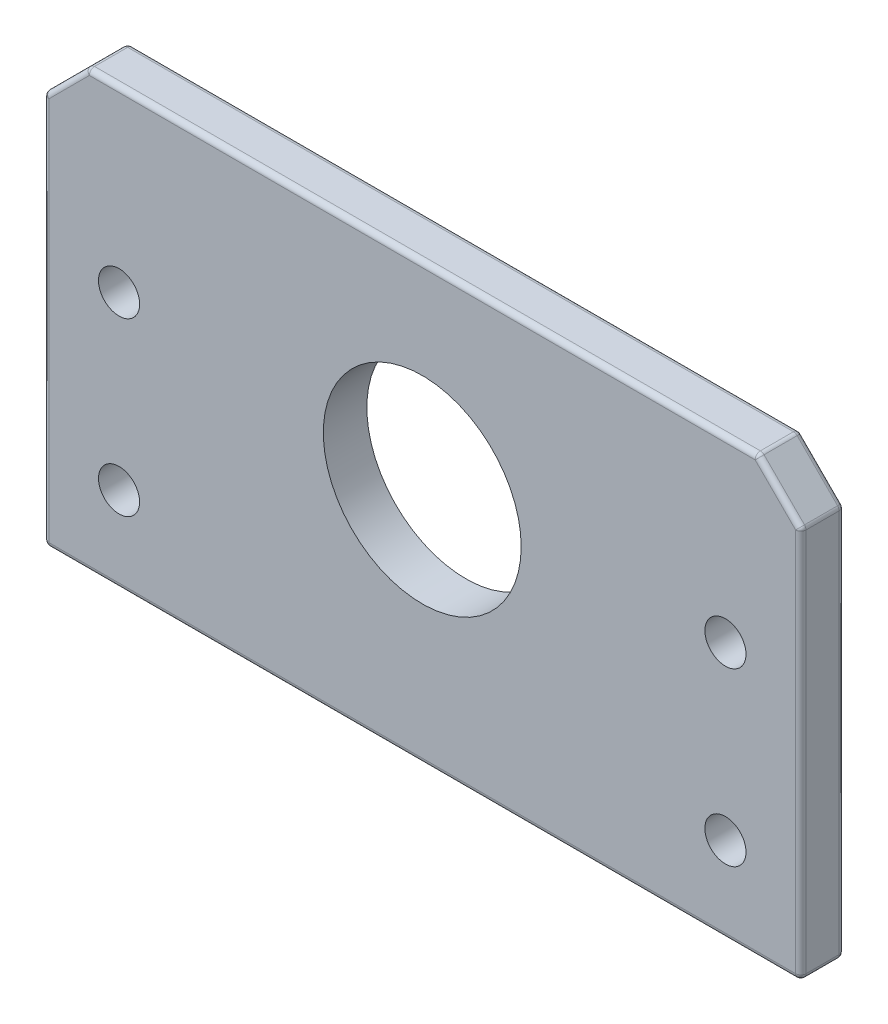
ISO-10303-21;
HEADER;
FILE_DESCRIPTION(('STEP AP214'),'2;1');
FILE_NAME('part.step','',(''),(''),'','','');
FILE_SCHEMA(('AUTOMOTIVE_DESIGN { 1 0 10303 214 1 1 1 1 }'));
ENDSEC;
DATA;
#1=APPLICATION_CONTEXT('core data for automotive mechanical design processes');
#2=APPLICATION_PROTOCOL_DEFINITION('international standard','automotive_design',2000,#1);
#3=PRODUCT_CONTEXT('',#1,'mechanical');
#4=PRODUCT('Part','Part','',(#3));
#5=PRODUCT_RELATED_PRODUCT_CATEGORY('part','',(#4));
#6=PRODUCT_DEFINITION_FORMATION('','',#4);
#7=PRODUCT_DEFINITION_CONTEXT('part definition',#1,'design');
#8=PRODUCT_DEFINITION('design','',#6,#7);
#9=PRODUCT_DEFINITION_SHAPE('','',#8);
#10=(LENGTH_UNIT() NAMED_UNIT(*) SI_UNIT(.MILLI.,.METRE.));
#11=(NAMED_UNIT(*) PLANE_ANGLE_UNIT() SI_UNIT($,.RADIAN.));
#12=(NAMED_UNIT(*) SI_UNIT($,.STERADIAN.) SOLID_ANGLE_UNIT());
#13=UNCERTAINTY_MEASURE_WITH_UNIT(LENGTH_MEASURE(1.E-05),#10,'distance_accuracy_value','');
#14=(GEOMETRIC_REPRESENTATION_CONTEXT(3) GLOBAL_UNCERTAINTY_ASSIGNED_CONTEXT((#13)) GLOBAL_UNIT_ASSIGNED_CONTEXT((#10,
#11,#12)) REPRESENTATION_CONTEXT('',''));
#15=CARTESIAN_POINT('',(0.,0.,0.));
#16=DIRECTION('',(0.,0.,1.));
#17=DIRECTION('',(1.,0.,0.));
#18=AXIS2_PLACEMENT_3D('',#15,#16,#17);
#19=CARTESIAN_POINT('',(-55.245,-63.5,-3.175));
#20=DIRECTION('',(-1.,0.,0.));
#21=DIRECTION('',(0.,0.,1.));
#22=AXIS2_PLACEMENT_3D('',#19,#20,#21);
#23=PLANE('',#22);
#24=DIRECTION('',(0.,1.,0.));
#25=VECTOR('',#24,1.);
#26=CARTESIAN_POINT('',(-55.245,-63.5,-2.413));
#27=LINE('',#26,#25);
#28=CARTESIAN_POINT('',(-55.245,-6.66563073452831,-2.413));
#29=VERTEX_POINT('',#28);
#30=CARTESIAN_POINT('',(-55.245,-62.738,-2.413));
#31=VERTEX_POINT('',#30);
#32=EDGE_CURVE('E48',#29,#31,#27,.F.);
#33=ORIENTED_EDGE('',*,*,#32,.T.);
#34=DIRECTION('',(0.,0.,1.));
#35=VECTOR('',#34,1.);
#36=CARTESIAN_POINT('',(-55.245,-62.738,3.175));
#37=LINE('',#36,#35);
#38=CARTESIAN_POINT('',(-55.245,-62.738,2.413));
#39=VERTEX_POINT('',#38);
#40=EDGE_CURVE('E11',#31,#39,#37,.T.);
#41=ORIENTED_EDGE('',*,*,#40,.T.);
#42=DIRECTION('',(0.,1.,0.));
#43=VECTOR('',#42,1.);
#44=CARTESIAN_POINT('',(-55.245,-63.5,2.413));
#45=LINE('',#44,#43);
#46=CARTESIAN_POINT('',(-55.245,-6.66563073452831,2.413));
#47=VERTEX_POINT('',#46);
#48=EDGE_CURVE('E271',#39,#47,#45,.T.);
#49=ORIENTED_EDGE('',*,*,#48,.T.);
#50=DIRECTION('',(0.,0.,1.));
#51=VECTOR('',#50,1.);
#52=CARTESIAN_POINT('',(-55.245,-6.66563073452831,-3.175));
#53=LINE('',#52,#51);
#54=EDGE_CURVE('E59',#47,#29,#53,.F.);
#55=ORIENTED_EDGE('',*,*,#54,.T.);
#56=EDGE_LOOP('',(#33,#41,#49,#55));
#57=FACE_BOUND('',#56,.T.);
#58=ADVANCED_FACE('F39',(#57),#23,.T.);
#59=CARTESIAN_POINT('',(-55.245,-63.5,-3.175));
#60=DIRECTION('',(0.,0.,-1.));
#61=DIRECTION('',(-1.,0.,0.));
#62=AXIS2_PLACEMENT_3D('',#59,#60,#61);
#63=PLANE('',#62);
#64=DIRECTION('',(0.,1.,0.));
#65=VECTOR('',#64,1.);
#66=CARTESIAN_POINT('',(54.483,-63.5,-3.175));
#67=LINE('',#66,#65);
#68=CARTESIAN_POINT('',(54.483,-6.66563073452829,-3.175));
#69=VERTEX_POINT('',#68);
#70=CARTESIAN_POINT('',(54.483,-62.738,-3.175));
#71=VERTEX_POINT('',#70);
#72=EDGE_CURVE('E231',#69,#71,#67,.F.);
#73=ORIENTED_EDGE('',*,*,#72,.T.);
#74=DIRECTION('',(-1.,0.,0.));
#75=VECTOR('',#74,1.);
#76=CARTESIAN_POINT('',(-55.245,-62.738,-3.175));
#77=LINE('',#76,#75);
#78=CARTESIAN_POINT('',(-54.483,-62.738,-3.175));
#79=VERTEX_POINT('',#78);
#80=EDGE_CURVE('E233',#71,#79,#77,.T.);
#81=ORIENTED_EDGE('',*,*,#80,.T.);
#82=DIRECTION('',(0.,1.,0.));
#83=VECTOR('',#82,1.);
#84=CARTESIAN_POINT('',(-54.483,-63.5,-3.175));
#85=LINE('',#84,#83);
#86=CARTESIAN_POINT('',(-54.483,-6.66563073452831,-3.175));
#87=VERTEX_POINT('',#86);
#88=EDGE_CURVE('E223',#79,#87,#85,.T.);
#89=ORIENTED_EDGE('',*,*,#88,.T.);
#90=DIRECTION('',(-0.707106781186546,-0.707106781186549,0.));
#91=VECTOR('',#90,1.);
#92=CARTESIAN_POINT('',(-83.2811846327358,-35.4638153672643,-3.175));
#93=LINE('',#92,#91);
#94=CARTESIAN_POINT('',(-48.5793692654717,-0.762,-3.175));
#95=VERTEX_POINT('',#94);
#96=EDGE_CURVE('E225',#87,#95,#93,.F.);
#97=ORIENTED_EDGE('',*,*,#96,.T.);
#98=DIRECTION('',(-1.,0.,0.));
#99=VECTOR('',#98,1.);
#100=CARTESIAN_POINT('',(-55.245,-0.761999999999999,-3.175));
#101=LINE('',#100,#99);
#102=CARTESIAN_POINT('',(48.5793692654717,-0.762,-3.175));
#103=VERTEX_POINT('',#102);
#104=EDGE_CURVE('E227',#95,#103,#101,.F.);
#105=ORIENTED_EDGE('',*,*,#104,.T.);
#106=DIRECTION('',(-0.707106781186546,0.707106781186549,0.));
#107=VECTOR('',#106,1.);
#108=CARTESIAN_POINT('',(28.0361846327361,19.7811846327357,-3.175));
#109=LINE('',#108,#107);
#110=EDGE_CURVE('E229',#103,#69,#109,.F.);
#111=ORIENTED_EDGE('',*,*,#110,.T.);
#112=EDGE_LOOP('',(#73,#81,#89,#97,#105,#111));
#113=FACE_BOUND('',#112,.T.);
#114=CARTESIAN_POINT('',(-44.245,-26.,-3.175));
#115=DIRECTION('',(0.,0.,-1.));
#116=DIRECTION('',(-1.,0.,0.));
#117=AXIS2_PLACEMENT_3D('',#114,#115,#116);
#118=CIRCLE('',#117,3.);
#119=CARTESIAN_POINT('',(-47.245,-26.,-3.175));
#120=VERTEX_POINT('',#119);
#121=EDGE_CURVE('E364',#120,#120,#118,.T.);
#122=ORIENTED_EDGE('',*,*,#121,.F.);
#123=EDGE_LOOP('',(#122));
#124=FACE_BOUND('',#123,.T.);
#125=CARTESIAN_POINT('',(-44.245,-51.,-3.175));
#126=DIRECTION('',(0.,0.,-1.));
#127=DIRECTION('',(-1.,0.,0.));
#128=AXIS2_PLACEMENT_3D('',#125,#126,#127);
#129=CIRCLE('',#128,3.);
#130=CARTESIAN_POINT('',(-47.245,-51.,-3.175));
#131=VERTEX_POINT('',#130);
#132=EDGE_CURVE('E375',#131,#131,#129,.T.);
#133=ORIENTED_EDGE('',*,*,#132,.F.);
#134=EDGE_LOOP('',(#133));
#135=FACE_BOUND('',#134,.T.);
#136=CARTESIAN_POINT('',(44.245,-51.,-3.175));
#137=DIRECTION('',(0.,0.,-1.));
#138=DIRECTION('',(-1.,0.,0.));
#139=AXIS2_PLACEMENT_3D('',#136,#137,#138);
#140=CIRCLE('',#139,3.);
#141=CARTESIAN_POINT('',(41.245,-51.,-3.175));
#142=VERTEX_POINT('',#141);
#143=EDGE_CURVE('E383',#142,#142,#140,.T.);
#144=ORIENTED_EDGE('',*,*,#143,.F.);
#145=EDGE_LOOP('',(#144));
#146=FACE_BOUND('',#145,.T.);
#147=CARTESIAN_POINT('',(44.245,-26.,-3.175));
#148=DIRECTION('',(0.,0.,-1.));
#149=DIRECTION('',(-1.,0.,0.));
#150=AXIS2_PLACEMENT_3D('',#147,#148,#149);
#151=CIRCLE('',#150,3.);
#152=CARTESIAN_POINT('',(41.245,-26.,-3.175));
#153=VERTEX_POINT('',#152);
#154=EDGE_CURVE('E389',#153,#153,#151,.T.);
#155=ORIENTED_EDGE('',*,*,#154,.F.);
#156=EDGE_LOOP('',(#155));
#157=FACE_BOUND('',#156,.T.);
#158=CARTESIAN_POINT('',(0.,-28.8150046,-3.175));
#159=DIRECTION('',(0.,0.,1.));
#160=DIRECTION('',(1.,0.,0.));
#161=AXIS2_PLACEMENT_3D('',#158,#159,#160);
#162=CIRCLE('',#161,14.437499981);
#163=CARTESIAN_POINT('',(14.437499981,-28.8150046,-3.175));
#164=VERTEX_POINT('',#163);
#165=EDGE_CURVE('E200',#164,#164,#162,.T.);
#166=ORIENTED_EDGE('',*,*,#165,.T.);
#167=EDGE_LOOP('',(#166));
#168=FACE_BOUND('',#167,.T.);
#169=ADVANCED_FACE('F412',(#113,#124,#135,#146,#157,#168),#63,.T.);
#170=CARTESIAN_POINT('',(55.245,-63.5,-3.175));
#171=DIRECTION('',(1.,0.,0.));
#172=DIRECTION('',(0.,0.,-1.));
#173=AXIS2_PLACEMENT_3D('',#170,#171,#172);
#174=PLANE('',#173);
#175=DIRECTION('',(0.,1.,0.));
#176=VECTOR('',#175,1.);
#177=CARTESIAN_POINT('',(55.245,-63.5,2.413));
#178=LINE('',#177,#176);
#179=CARTESIAN_POINT('',(55.245,-6.66563073452831,2.413));
#180=VERTEX_POINT('',#179);
#181=CARTESIAN_POINT('',(55.245,-62.738,2.413));
#182=VERTEX_POINT('',#181);
#183=EDGE_CURVE('E240',#180,#182,#178,.F.);
#184=ORIENTED_EDGE('',*,*,#183,.T.);
#185=DIRECTION('',(0.,0.,-1.));
#186=VECTOR('',#185,1.);
#187=CARTESIAN_POINT('',(55.245,-62.738,-3.175));
#188=LINE('',#187,#186);
#189=CARTESIAN_POINT('',(55.245,-62.738,-2.413));
#190=VERTEX_POINT('',#189);
#191=EDGE_CURVE('E242',#182,#190,#188,.T.);
#192=ORIENTED_EDGE('',*,*,#191,.T.);
#193=DIRECTION('',(0.,1.,0.));
#194=VECTOR('',#193,1.);
#195=CARTESIAN_POINT('',(55.245,-63.5,-2.413));
#196=LINE('',#195,#194);
#197=CARTESIAN_POINT('',(55.245,-6.66563073452831,-2.413));
#198=VERTEX_POINT('',#197);
#199=EDGE_CURVE('E238',#190,#198,#196,.T.);
#200=ORIENTED_EDGE('',*,*,#199,.T.);
#201=DIRECTION('',(0.,0.,-1.));
#202=VECTOR('',#201,1.);
#203=CARTESIAN_POINT('',(55.245,-6.66563073452831,-3.175));
#204=LINE('',#203,#202);
#205=EDGE_CURVE('E236',#198,#180,#204,.F.);
#206=ORIENTED_EDGE('',*,*,#205,.T.);
#207=EDGE_LOOP('',(#184,#192,#200,#206));
#208=FACE_BOUND('',#207,.T.);
#209=ADVANCED_FACE('F403',(#208),#174,.T.);
#210=CARTESIAN_POINT('',(-55.245,-63.5,3.175));
#211=DIRECTION('',(0.,0.,1.));
#212=DIRECTION('',(1.,0.,0.));
#213=AXIS2_PLACEMENT_3D('',#210,#211,#212);
#214=PLANE('',#213);
#215=DIRECTION('',(0.,1.,0.));
#216=VECTOR('',#215,1.);
#217=CARTESIAN_POINT('',(-54.483,-63.5,3.175));
#218=LINE('',#217,#216);
#219=CARTESIAN_POINT('',(-54.483,-6.66563073452831,3.175));
#220=VERTEX_POINT('',#219);
#221=CARTESIAN_POINT('',(-54.483,-62.738,3.175));
#222=VERTEX_POINT('',#221);
#223=EDGE_CURVE('E169',#220,#222,#218,.F.);
#224=ORIENTED_EDGE('',*,*,#223,.T.);
#225=DIRECTION('',(1.,0.,0.));
#226=VECTOR('',#225,1.);
#227=CARTESIAN_POINT('',(55.245,-62.738,3.175));
#228=LINE('',#227,#226);
#229=CARTESIAN_POINT('',(54.483,-62.738,3.175));
#230=VERTEX_POINT('',#229);
#231=EDGE_CURVE('E212',#222,#230,#228,.T.);
#232=ORIENTED_EDGE('',*,*,#231,.T.);
#233=DIRECTION('',(0.,1.,0.));
#234=VECTOR('',#233,1.);
#235=CARTESIAN_POINT('',(54.483,-63.5,3.175));
#236=LINE('',#235,#234);
#237=CARTESIAN_POINT('',(54.483,-6.66563073452829,3.175));
#238=VERTEX_POINT('',#237);
#239=EDGE_CURVE('E210',#230,#238,#236,.T.);
#240=ORIENTED_EDGE('',*,*,#239,.T.);
#241=DIRECTION('',(0.707106781186546,-0.707106781186549,0.));
#242=VECTOR('',#241,1.);
#243=CARTESIAN_POINT('',(28.0361846327361,19.7811846327357,3.175));
#244=LINE('',#243,#242);
#245=CARTESIAN_POINT('',(48.5793692654717,-0.762,3.175));
#246=VERTEX_POINT('',#245);
#247=EDGE_CURVE('E208',#238,#246,#244,.F.);
#248=ORIENTED_EDGE('',*,*,#247,.T.);
#249=DIRECTION('',(1.,0.,0.));
#250=VECTOR('',#249,1.);
#251=CARTESIAN_POINT('',(-55.245,-0.761999999999999,3.175));
#252=LINE('',#251,#250);
#253=CARTESIAN_POINT('',(-48.5793692654717,-0.762000000000001,3.175));
#254=VERTEX_POINT('',#253);
#255=EDGE_CURVE('E172',#246,#254,#252,.F.);
#256=ORIENTED_EDGE('',*,*,#255,.T.);
#257=DIRECTION('',(0.707106781186546,0.707106781186549,0.));
#258=VECTOR('',#257,1.);
#259=CARTESIAN_POINT('',(-83.2811846327358,-35.4638153672643,3.175));
#260=LINE('',#259,#258);
#261=EDGE_CURVE('E163',#254,#220,#260,.F.);
#262=ORIENTED_EDGE('',*,*,#261,.T.);
#263=EDGE_LOOP('',(#224,#232,#240,#248,#256,#262));
#264=FACE_BOUND('',#263,.T.);
#265=CARTESIAN_POINT('',(-44.245,-26.,3.175));
#266=DIRECTION('',(0.,0.,-1.));
#267=DIRECTION('',(-1.,0.,0.));
#268=AXIS2_PLACEMENT_3D('',#265,#266,#267);
#269=CIRCLE('',#268,3.);
#270=CARTESIAN_POINT('',(-47.245,-26.,3.175));
#271=VERTEX_POINT('',#270);
#272=EDGE_CURVE('E370',#271,#271,#269,.T.);
#273=ORIENTED_EDGE('',*,*,#272,.T.);
#274=EDGE_LOOP('',(#273));
#275=FACE_BOUND('',#274,.T.);
#276=CARTESIAN_POINT('',(-44.245,-51.,3.175));
#277=DIRECTION('',(0.,0.,-1.));
#278=DIRECTION('',(-1.,0.,0.));
#279=AXIS2_PLACEMENT_3D('',#276,#277,#278);
#280=CIRCLE('',#279,3.);
#281=CARTESIAN_POINT('',(-47.245,-51.,3.175));
#282=VERTEX_POINT('',#281);
#283=EDGE_CURVE('E380',#282,#282,#280,.T.);
#284=ORIENTED_EDGE('',*,*,#283,.T.);
#285=EDGE_LOOP('',(#284));
#286=FACE_BOUND('',#285,.T.);
#287=CARTESIAN_POINT('',(44.245,-51.,3.175));
#288=DIRECTION('',(0.,0.,-1.));
#289=DIRECTION('',(-1.,0.,0.));
#290=AXIS2_PLACEMENT_3D('',#287,#288,#289);
#291=CIRCLE('',#290,3.);
#292=CARTESIAN_POINT('',(41.245,-51.,3.175));
#293=VERTEX_POINT('',#292);
#294=EDGE_CURVE('E386',#293,#293,#291,.T.);
#295=ORIENTED_EDGE('',*,*,#294,.T.);
#296=EDGE_LOOP('',(#295));
#297=FACE_BOUND('',#296,.T.);
#298=CARTESIAN_POINT('',(44.245,-26.,3.175));
#299=DIRECTION('',(0.,0.,-1.));
#300=DIRECTION('',(-1.,0.,0.));
#301=AXIS2_PLACEMENT_3D('',#298,#299,#300);
#302=CIRCLE('',#301,3.);
#303=CARTESIAN_POINT('',(41.245,-26.,3.175));
#304=VERTEX_POINT('',#303);
#305=EDGE_CURVE('E392',#304,#304,#302,.T.);
#306=ORIENTED_EDGE('',*,*,#305,.T.);
#307=EDGE_LOOP('',(#306));
#308=FACE_BOUND('',#307,.T.);
#309=CARTESIAN_POINT('',(0.,-28.8150046,3.175));
#310=DIRECTION('',(0.,0.,1.));
#311=DIRECTION('',(1.,0.,0.));
#312=AXIS2_PLACEMENT_3D('',#309,#310,#311);
#313=CIRCLE('',#312,14.437499981);
#314=CARTESIAN_POINT('',(14.437499981,-28.8150046,3.175));
#315=VERTEX_POINT('',#314);
#316=EDGE_CURVE('E203',#315,#315,#313,.T.);
#317=ORIENTED_EDGE('',*,*,#316,.F.);
#318=EDGE_LOOP('',(#317));
#319=FACE_BOUND('',#318,.T.);
#320=ADVANCED_FACE('F165',(#264,#275,#286,#297,#308,#319),#214,.T.);
#321=CARTESIAN_POINT('',(0.,-63.5,0.));
#322=DIRECTION('',(0.,1.,0.));
#323=DIRECTION('',(0.,0.,1.));
#324=AXIS2_PLACEMENT_3D('',#321,#322,#323);
#325=PLANE('',#324);
#326=DIRECTION('',(-1.,0.,0.));
#327=VECTOR('',#326,1.);
#328=CARTESIAN_POINT('',(55.245,-63.5,-2.413));
#329=LINE('',#328,#327);
#330=CARTESIAN_POINT('',(-54.483,-63.5,-2.413));
#331=VERTEX_POINT('',#330);
#332=CARTESIAN_POINT('',(54.483,-63.5,-2.413));
#333=VERTEX_POINT('',#332);
#334=EDGE_CURVE('E216',#331,#333,#329,.F.);
#335=ORIENTED_EDGE('',*,*,#334,.T.);
#336=DIRECTION('',(0.,0.,-1.));
#337=VECTOR('',#336,1.);
#338=CARTESIAN_POINT('',(54.483,-63.5,3.175));
#339=LINE('',#338,#337);
#340=CARTESIAN_POINT('',(54.483,-63.5,2.413));
#341=VERTEX_POINT('',#340);
#342=EDGE_CURVE('E221',#333,#341,#339,.F.);
#343=ORIENTED_EDGE('',*,*,#342,.T.);
#344=DIRECTION('',(1.,0.,0.));
#345=VECTOR('',#344,1.);
#346=CARTESIAN_POINT('',(-55.245,-63.5,2.413));
#347=LINE('',#346,#345);
#348=CARTESIAN_POINT('',(-54.483,-63.5,2.413));
#349=VERTEX_POINT('',#348);
#350=EDGE_CURVE('E218',#341,#349,#347,.F.);
#351=ORIENTED_EDGE('',*,*,#350,.T.);
#352=DIRECTION('',(0.,0.,1.));
#353=VECTOR('',#352,1.);
#354=CARTESIAN_POINT('',(-54.483,-63.5,-3.175));
#355=LINE('',#354,#353);
#356=EDGE_CURVE('E214',#349,#331,#355,.F.);
#357=ORIENTED_EDGE('',*,*,#356,.T.);
#358=EDGE_LOOP('',(#335,#343,#351,#357));
#359=FACE_BOUND('',#358,.T.);
#360=ADVANCED_FACE('F402',(#359),#325,.F.);
#361=CARTESIAN_POINT('',(0.,0.,0.));
#362=DIRECTION('',(0.,1.,0.));
#363=DIRECTION('',(0.,0.,1.));
#364=AXIS2_PLACEMENT_3D('',#361,#362,#363);
#365=PLANE('',#364);
#366=DIRECTION('',(1.,0.,0.));
#367=VECTOR('',#366,1.);
#368=CARTESIAN_POINT('',(0.,0.,2.413));
#369=LINE('',#368,#367);
#370=CARTESIAN_POINT('',(-48.5793692654717,0.,2.413));
#371=VERTEX_POINT('',#370);
#372=CARTESIAN_POINT('',(48.5793692654717,0.,2.413));
#373=VERTEX_POINT('',#372);
#374=EDGE_CURVE('E258',#371,#373,#369,.T.);
#375=ORIENTED_EDGE('',*,*,#374,.T.);
#376=DIRECTION('',(0.,0.,1.));
#377=VECTOR('',#376,1.);
#378=CARTESIAN_POINT('',(48.5793692654717,0.,0.));
#379=LINE('',#378,#377);
#380=CARTESIAN_POINT('',(48.5793692654717,0.,-2.413));
#381=VERTEX_POINT('',#380);
#382=EDGE_CURVE('E260',#373,#381,#379,.F.);
#383=ORIENTED_EDGE('',*,*,#382,.T.);
#384=DIRECTION('',(-1.,0.,0.));
#385=VECTOR('',#384,1.);
#386=CARTESIAN_POINT('',(0.,0.,-2.413));
#387=LINE('',#386,#385);
#388=CARTESIAN_POINT('',(-48.5793692654717,0.,-2.413));
#389=VERTEX_POINT('',#388);
#390=EDGE_CURVE('E256',#381,#389,#387,.T.);
#391=ORIENTED_EDGE('',*,*,#390,.T.);
#392=DIRECTION('',(0.,0.,-1.));
#393=VECTOR('',#392,1.);
#394=CARTESIAN_POINT('',(-48.5793692654717,0.,0.));
#395=LINE('',#394,#393);
#396=EDGE_CURVE('E254',#389,#371,#395,.F.);
#397=ORIENTED_EDGE('',*,*,#396,.T.);
#398=EDGE_LOOP('',(#375,#383,#391,#397));
#399=FACE_BOUND('',#398,.T.);
#400=ADVANCED_FACE('F409',(#399),#365,.T.);
#401=CARTESIAN_POINT('',(0.,-28.8150046,-3.175));
#402=DIRECTION('',(0.,0.,1.));
#403=DIRECTION('',(1.,0.,0.));
#404=AXIS2_PLACEMENT_3D('',#401,#402,#403);
#405=CYLINDRICAL_SURFACE('',#404,14.437499981);
#406=ORIENTED_EDGE('',*,*,#165,.F.);
#407=EDGE_LOOP('',(#406));
#408=FACE_BOUND('',#407,.T.);
#409=ORIENTED_EDGE('',*,*,#316,.T.);
#410=EDGE_LOOP('',(#409));
#411=FACE_BOUND('',#410,.T.);
#412=ADVANCED_FACE('F399',(#408,#411),#405,.F.);
#413=CARTESIAN_POINT('',(-48.895,0.,0.));
#414=DIRECTION('',(0.707106781186549,-0.707106781186546,0.));
#415=DIRECTION('',(0.,0.,1.));
#416=AXIS2_PLACEMENT_3D('',#413,#414,#415);
#417=PLANE('',#416);
#418=DIRECTION('',(-0.707106781186546,-0.707106781186549,0.));
#419=VECTOR('',#418,1.);
#420=CARTESIAN_POINT('',(-48.895,0.,2.413));
#421=LINE('',#420,#419);
#422=CARTESIAN_POINT('',(-55.0218153672642,-6.12681536726416,2.413));
#423=VERTEX_POINT('',#422);
#424=CARTESIAN_POINT('',(-49.1181846327359,-0.223184632735852,2.413));
#425=VERTEX_POINT('',#424);
#426=EDGE_CURVE('E182',#423,#425,#421,.F.);
#427=ORIENTED_EDGE('',*,*,#426,.T.);
#428=DIRECTION('',(0.,0.,1.));
#429=VECTOR('',#428,1.);
#430=CARTESIAN_POINT('',(-49.1181846327359,-0.223184632735851,0.));
#431=LINE('',#430,#429);
#432=CARTESIAN_POINT('',(-49.1181846327359,-0.223184632735852,-2.413));
#433=VERTEX_POINT('',#432);
#434=EDGE_CURVE('E268',#425,#433,#431,.F.);
#435=ORIENTED_EDGE('',*,*,#434,.T.);
#436=DIRECTION('',(0.707106781186546,0.707106781186549,0.));
#437=VECTOR('',#436,1.);
#438=CARTESIAN_POINT('',(-48.895,0.,-2.413));
#439=LINE('',#438,#437);
#440=CARTESIAN_POINT('',(-55.0218153672642,-6.12681536726416,-2.413));
#441=VERTEX_POINT('',#440);
#442=EDGE_CURVE('E265',#433,#441,#439,.F.);
#443=ORIENTED_EDGE('',*,*,#442,.T.);
#444=DIRECTION('',(0.,0.,-1.));
#445=VECTOR('',#444,1.);
#446=CARTESIAN_POINT('',(-55.0218153672642,-6.12681536726416,0.));
#447=LINE('',#446,#445);
#448=EDGE_CURVE('E263',#441,#423,#447,.F.);
#449=ORIENTED_EDGE('',*,*,#448,.T.);
#450=EDGE_LOOP('',(#427,#435,#443,#449));
#451=FACE_BOUND('',#450,.T.);
#452=ADVANCED_FACE('F424',(#451),#417,.F.);
#453=CARTESIAN_POINT('',(48.895,0.,0.));
#454=DIRECTION('',(-0.707106781186549,-0.707106781186546,0.));
#455=DIRECTION('',(0.,0.,-1.));
#456=AXIS2_PLACEMENT_3D('',#453,#454,#455);
#457=PLANE('',#456);
#458=DIRECTION('',(0.,0.,1.));
#459=VECTOR('',#458,1.);
#460=CARTESIAN_POINT('',(55.0218153672642,-6.12681536726416,0.));
#461=LINE('',#460,#459);
#462=CARTESIAN_POINT('',(55.0218153672642,-6.12681536726416,2.413));
#463=VERTEX_POINT('',#462);
#464=CARTESIAN_POINT('',(55.0218153672642,-6.12681536726416,-2.413));
#465=VERTEX_POINT('',#464);
#466=EDGE_CURVE('E249',#463,#465,#461,.F.);
#467=ORIENTED_EDGE('',*,*,#466,.T.);
#468=DIRECTION('',(0.707106781186546,-0.707106781186549,0.));
#469=VECTOR('',#468,1.);
#470=CARTESIAN_POINT('',(48.895,0.,-2.413));
#471=LINE('',#470,#469);
#472=CARTESIAN_POINT('',(49.1181846327359,-0.223184632735851,-2.413));
#473=VERTEX_POINT('',#472);
#474=EDGE_CURVE('E251',#465,#473,#471,.F.);
#475=ORIENTED_EDGE('',*,*,#474,.T.);
#476=DIRECTION('',(0.,0.,-1.));
#477=VECTOR('',#476,1.);
#478=CARTESIAN_POINT('',(49.1181846327359,-0.223184632735851,0.));
#479=LINE('',#478,#477);
#480=CARTESIAN_POINT('',(49.1181846327359,-0.223184632735851,2.413));
#481=VERTEX_POINT('',#480);
#482=EDGE_CURVE('E245',#473,#481,#479,.F.);
#483=ORIENTED_EDGE('',*,*,#482,.T.);
#484=DIRECTION('',(-0.707106781186546,0.707106781186549,0.));
#485=VECTOR('',#484,1.);
#486=CARTESIAN_POINT('',(48.895,0.,2.413));
#487=LINE('',#486,#485);
#488=EDGE_CURVE('E247',#481,#463,#487,.F.);
#489=ORIENTED_EDGE('',*,*,#488,.T.);
#490=EDGE_LOOP('',(#467,#475,#483,#489));
#491=FACE_BOUND('',#490,.T.);
#492=ADVANCED_FACE('F430',(#491),#457,.F.);
#493=CARTESIAN_POINT('',(44.245,-26.,-3.175));
#494=DIRECTION('',(0.,0.,-1.));
#495=DIRECTION('',(-1.,0.,0.));
#496=AXIS2_PLACEMENT_3D('',#493,#494,#495);
#497=CYLINDRICAL_SURFACE('',#496,3.);
#498=ORIENTED_EDGE('',*,*,#305,.F.);
#499=EDGE_LOOP('',(#498));
#500=FACE_BOUND('',#499,.T.);
#501=ORIENTED_EDGE('',*,*,#154,.T.);
#502=EDGE_LOOP('',(#501));
#503=FACE_BOUND('',#502,.T.);
#504=ADVANCED_FACE('F436',(#500,#503),#497,.F.);
#505=CARTESIAN_POINT('',(44.245,-51.,-3.175));
#506=DIRECTION('',(0.,0.,-1.));
#507=DIRECTION('',(-1.,0.,0.));
#508=AXIS2_PLACEMENT_3D('',#505,#506,#507);
#509=CYLINDRICAL_SURFACE('',#508,3.);
#510=ORIENTED_EDGE('',*,*,#294,.F.);
#511=EDGE_LOOP('',(#510));
#512=FACE_BOUND('',#511,.T.);
#513=ORIENTED_EDGE('',*,*,#143,.T.);
#514=EDGE_LOOP('',(#513));
#515=FACE_BOUND('',#514,.T.);
#516=ADVANCED_FACE('F618',(#512,#515),#509,.F.);
#517=CARTESIAN_POINT('',(-44.245,-51.,-3.175));
#518=DIRECTION('',(0.,0.,-1.));
#519=DIRECTION('',(-1.,0.,0.));
#520=AXIS2_PLACEMENT_3D('',#517,#518,#519);
#521=CYLINDRICAL_SURFACE('',#520,3.);
#522=ORIENTED_EDGE('',*,*,#283,.F.);
#523=EDGE_LOOP('',(#522));
#524=FACE_BOUND('',#523,.T.);
#525=ORIENTED_EDGE('',*,*,#132,.T.);
#526=EDGE_LOOP('',(#525));
#527=FACE_BOUND('',#526,.T.);
#528=ADVANCED_FACE('F622',(#524,#527),#521,.F.);
#529=CARTESIAN_POINT('',(-44.245,-26.,-3.175));
#530=DIRECTION('',(0.,0.,-1.));
#531=DIRECTION('',(-1.,0.,0.));
#532=AXIS2_PLACEMENT_3D('',#529,#530,#531);
#533=CYLINDRICAL_SURFACE('',#532,3.);
#534=ORIENTED_EDGE('',*,*,#272,.F.);
#535=EDGE_LOOP('',(#534));
#536=FACE_BOUND('',#535,.T.);
#537=ORIENTED_EDGE('',*,*,#121,.T.);
#538=EDGE_LOOP('',(#537));
#539=FACE_BOUND('',#538,.T.);
#540=ADVANCED_FACE('F547',(#536,#539),#533,.F.);
#541=CARTESIAN_POINT('',(0.,-0.762,-2.413));
#542=DIRECTION('',(-1.,0.,0.));
#543=DIRECTION('',(0.,0.,1.));
#544=AXIS2_PLACEMENT_3D('',#541,#542,#543);
#545=CYLINDRICAL_SURFACE('',#544,0.762);
#546=CARTESIAN_POINT('',(-48.5793692654717,-0.762,-2.413));
#547=DIRECTION('',(-1.,0.,0.));
#548=DIRECTION('',(0.,0.,1.));
#549=AXIS2_PLACEMENT_3D('',#546,#547,#548);
#550=CIRCLE('',#549,0.762);
#551=EDGE_CURVE('E43',#389,#95,#550,.T.);
#552=ORIENTED_EDGE('',*,*,#551,.F.);
#553=ORIENTED_EDGE('',*,*,#390,.F.);
#554=CARTESIAN_POINT('',(48.5793692654717,-0.762,-2.413));
#555=DIRECTION('',(1.,0.,0.));
#556=DIRECTION('',(0.,1.,0.));
#557=AXIS2_PLACEMENT_3D('',#554,#555,#556);
#558=CIRCLE('',#557,0.762);
#559=EDGE_CURVE('E356',#103,#381,#558,.T.);
#560=ORIENTED_EDGE('',*,*,#559,.F.);
#561=ORIENTED_EDGE('',*,*,#104,.F.);
#562=EDGE_LOOP('',(#552,#553,#560,#561));
#563=FACE_BOUND('',#562,.T.);
#564=ADVANCED_FACE('F41',(#563),#545,.T.);
#565=CARTESIAN_POINT('',(-48.5793692654717,-0.762,-2.413));
#566=DIRECTION('',(0.,0.,-1.));
#567=DIRECTION('',(-1.,0.,0.));
#568=AXIS2_PLACEMENT_3D('',#565,#566,#567);
#569=SPHERICAL_SURFACE('',#568,0.762);
#570=CARTESIAN_POINT('',(-48.5793692654717,-0.761999999999999,-2.413));
#571=DIRECTION('',(0.,0.,-1.));
#572=DIRECTION('',(-1.,0.,0.));
#573=AXIS2_PLACEMENT_3D('',#570,#571,#572);
#574=CIRCLE('',#573,0.762);
#575=EDGE_CURVE('E351',#389,#433,#574,.F.);
#576=ORIENTED_EDGE('',*,*,#575,.F.);
#577=ORIENTED_EDGE('',*,*,#551,.T.);
#578=CARTESIAN_POINT('',(-48.5793692654717,-0.762,-2.413));
#579=DIRECTION('',(0.707106781186543,0.707106781186552,0.));
#580=DIRECTION('',(-0.707106781186552,0.707106781186543,0.));
#581=AXIS2_PLACEMENT_3D('',#578,#579,#580);
#582=CIRCLE('',#581,0.762);
#583=EDGE_CURVE('E354',#433,#95,#582,.F.);
#584=ORIENTED_EDGE('',*,*,#583,.F.);
#585=EDGE_LOOP('',(#576,#577,#584));
#586=FACE_BOUND('',#585,.T.);
#587=ADVANCED_FACE('F542',(#586),#569,.T.);
#588=CARTESIAN_POINT('',(48.5793692654717,-0.762,-2.413));
#589=DIRECTION('',(0.,0.,-1.));
#590=DIRECTION('',(-1.,0.,0.));
#591=AXIS2_PLACEMENT_3D('',#588,#589,#590);
#592=SPHERICAL_SURFACE('',#591,0.762);
#593=CARTESIAN_POINT('',(48.5793692654717,-0.762,-2.413));
#594=DIRECTION('',(-0.707106781186548,0.707106781186547,0.));
#595=DIRECTION('',(-0.707106781186547,-0.707106781186548,0.));
#596=AXIS2_PLACEMENT_3D('',#593,#594,#595);
#597=CIRCLE('',#596,0.762);
#598=EDGE_CURVE('E346',#103,#473,#597,.F.);
#599=ORIENTED_EDGE('',*,*,#598,.F.);
#600=ORIENTED_EDGE('',*,*,#559,.T.);
#601=CARTESIAN_POINT('',(48.5793692654717,-0.762,-2.413));
#602=DIRECTION('',(0.,0.,-1.));
#603=DIRECTION('',(-1.,0.,0.));
#604=AXIS2_PLACEMENT_3D('',#601,#602,#603);
#605=CIRCLE('',#604,0.762);
#606=EDGE_CURVE('E349',#473,#381,#605,.F.);
#607=ORIENTED_EDGE('',*,*,#606,.F.);
#608=EDGE_LOOP('',(#599,#600,#607));
#609=FACE_BOUND('',#608,.T.);
#610=ADVANCED_FACE('F539',(#609),#592,.T.);
#611=CARTESIAN_POINT('',(-83.2811846327358,-35.4638153672643,-2.413));
#612=DIRECTION('',(-0.707106781186546,-0.707106781186549,0.));
#613=DIRECTION('',(0.707106781186549,-0.707106781186546,0.));
#614=AXIS2_PLACEMENT_3D('',#611,#612,#613);
#615=CYLINDRICAL_SURFACE('',#614,0.762);
#616=ORIENTED_EDGE('',*,*,#583,.T.);
#617=ORIENTED_EDGE('',*,*,#96,.F.);
#618=CARTESIAN_POINT('',(-54.483,-6.66563073452831,-2.413));
#619=DIRECTION('',(-0.707106781186548,-0.707106781186548,0.));
#620=DIRECTION('',(0.707106781186548,-0.707106781186548,0.));
#621=AXIS2_PLACEMENT_3D('',#618,#619,#620);
#622=CIRCLE('',#621,0.762);
#623=EDGE_CURVE('E343',#441,#87,#622,.T.);
#624=ORIENTED_EDGE('',*,*,#623,.F.);
#625=ORIENTED_EDGE('',*,*,#442,.F.);
#626=EDGE_LOOP('',(#616,#617,#624,#625));
#627=FACE_BOUND('',#626,.T.);
#628=ADVANCED_FACE('F535',(#627),#615,.T.);
#629=CARTESIAN_POINT('',(-48.5793692654717,-0.762,0.));
#630=DIRECTION('',(0.,0.,-1.));
#631=DIRECTION('',(-1.,0.,0.));
#632=AXIS2_PLACEMENT_3D('',#629,#630,#631);
#633=CYLINDRICAL_SURFACE('',#632,0.762);
#634=ORIENTED_EDGE('',*,*,#575,.T.);
#635=ORIENTED_EDGE('',*,*,#434,.F.);
#636=CARTESIAN_POINT('',(-48.5793692654717,-0.762,2.413));
#637=DIRECTION('',(0.,0.,1.));
#638=DIRECTION('',(1.,0.,0.));
#639=AXIS2_PLACEMENT_3D('',#636,#637,#638);
#640=CIRCLE('',#639,0.762);
#641=EDGE_CURVE('E340',#371,#425,#640,.T.);
#642=ORIENTED_EDGE('',*,*,#641,.F.);
#643=ORIENTED_EDGE('',*,*,#396,.F.);
#644=EDGE_LOOP('',(#634,#635,#642,#643));
#645=FACE_BOUND('',#644,.T.);
#646=ADVANCED_FACE('F531',(#645),#633,.T.);
#647=CARTESIAN_POINT('',(0.,-0.762,2.413));
#648=DIRECTION('',(1.,0.,0.));
#649=DIRECTION('',(0.,0.,-1.));
#650=AXIS2_PLACEMENT_3D('',#647,#648,#649);
#651=CYLINDRICAL_SURFACE('',#650,0.762);
#652=CARTESIAN_POINT('',(48.5793692654717,-0.762,2.413));
#653=DIRECTION('',(1.,0.,0.));
#654=DIRECTION('',(0.,0.,-1.));
#655=AXIS2_PLACEMENT_3D('',#652,#653,#654);
#656=CIRCLE('',#655,0.762);
#657=EDGE_CURVE('E334',#373,#246,#656,.T.);
#658=ORIENTED_EDGE('',*,*,#657,.F.);
#659=ORIENTED_EDGE('',*,*,#374,.F.);
#660=CARTESIAN_POINT('',(-48.5793692654717,-0.762,2.413));
#661=DIRECTION('',(-1.,0.,0.));
#662=DIRECTION('',(0.,-1.,0.));
#663=AXIS2_PLACEMENT_3D('',#660,#661,#662);
#664=CIRCLE('',#663,0.762);
#665=EDGE_CURVE('E337',#254,#371,#664,.T.);
#666=ORIENTED_EDGE('',*,*,#665,.F.);
#667=ORIENTED_EDGE('',*,*,#255,.F.);
#668=EDGE_LOOP('',(#658,#659,#666,#667));
#669=FACE_BOUND('',#668,.T.);
#670=ADVANCED_FACE('F527',(#669),#651,.T.);
#671=CARTESIAN_POINT('',(48.5793692654717,-0.762,0.));
#672=DIRECTION('',(0.,0.,1.));
#673=DIRECTION('',(1.,0.,0.));
#674=AXIS2_PLACEMENT_3D('',#671,#672,#673);
#675=CYLINDRICAL_SURFACE('',#674,0.762);
#676=ORIENTED_EDGE('',*,*,#606,.T.);
#677=ORIENTED_EDGE('',*,*,#382,.F.);
#678=CARTESIAN_POINT('',(48.5793692654717,-0.761999999999999,2.413));
#679=DIRECTION('',(0.,0.,1.));
#680=DIRECTION('',(1.,0.,0.));
#681=AXIS2_PLACEMENT_3D('',#678,#679,#680);
#682=CIRCLE('',#681,0.762);
#683=EDGE_CURVE('E331',#481,#373,#682,.T.);
#684=ORIENTED_EDGE('',*,*,#683,.F.);
#685=ORIENTED_EDGE('',*,*,#482,.F.);
#686=EDGE_LOOP('',(#676,#677,#684,#685));
#687=FACE_BOUND('',#686,.T.);
#688=ADVANCED_FACE('F523',(#687),#675,.T.);
#689=CARTESIAN_POINT('',(28.0361846327361,19.7811846327357,-2.413));
#690=DIRECTION('',(-0.707106781186546,0.707106781186549,0.));
#691=DIRECTION('',(-0.707106781186549,-0.707106781186546,0.));
#692=AXIS2_PLACEMENT_3D('',#689,#690,#691);
#693=CYLINDRICAL_SURFACE('',#692,0.762);
#694=ORIENTED_EDGE('',*,*,#598,.T.);
#695=ORIENTED_EDGE('',*,*,#474,.F.);
#696=CARTESIAN_POINT('',(54.483,-6.66563073452829,-2.413));
#697=DIRECTION('',(0.707106781186531,-0.707106781186563,0.));
#698=DIRECTION('',(0.707106781186564,0.707106781186532,0.));
#699=AXIS2_PLACEMENT_3D('',#696,#697,#698);
#700=CIRCLE('',#699,0.762);
#701=EDGE_CURVE('E328',#69,#465,#700,.T.);
#702=ORIENTED_EDGE('',*,*,#701,.F.);
#703=ORIENTED_EDGE('',*,*,#110,.F.);
#704=EDGE_LOOP('',(#694,#695,#702,#703));
#705=FACE_BOUND('',#704,.T.);
#706=ADVANCED_FACE('F519',(#705),#693,.T.);
#707=CARTESIAN_POINT('',(-54.483,-6.6656307345283,-2.413));
#708=DIRECTION('',(0.,0.,-1.));
#709=DIRECTION('',(0.,1.,0.));
#710=AXIS2_PLACEMENT_3D('',#707,#708,#709);
#711=SPHERICAL_SURFACE('',#710,0.762);
#712=CARTESIAN_POINT('',(-54.483,-6.66563073452831,-2.413));
#713=DIRECTION('',(0.,0.,-1.));
#714=DIRECTION('',(-1.,0.,0.));
#715=AXIS2_PLACEMENT_3D('',#712,#713,#714);
#716=CIRCLE('',#715,0.762);
#717=EDGE_CURVE('E323',#441,#29,#716,.F.);
#718=ORIENTED_EDGE('',*,*,#717,.F.);
#719=ORIENTED_EDGE('',*,*,#623,.T.);
#720=CARTESIAN_POINT('',(-54.483,-6.66563073452831,-2.413));
#721=DIRECTION('',(0.,1.,0.));
#722=DIRECTION('',(0.,0.,1.));
#723=AXIS2_PLACEMENT_3D('',#720,#721,#722);
#724=CIRCLE('',#723,0.762);
#725=EDGE_CURVE('E325',#29,#87,#724,.F.);
#726=ORIENTED_EDGE('',*,*,#725,.F.);
#727=EDGE_LOOP('',(#718,#719,#726));
#728=FACE_BOUND('',#727,.T.);
#729=ADVANCED_FACE('F515',(#728),#711,.T.);
#730=CARTESIAN_POINT('',(-48.5793692654717,-0.762,2.413));
#731=DIRECTION('',(0.,0.,1.));
#732=DIRECTION('',(0.,-1.,0.));
#733=AXIS2_PLACEMENT_3D('',#730,#731,#732);
#734=SPHERICAL_SURFACE('',#733,0.762);
#735=ORIENTED_EDGE('',*,*,#665,.T.);
#736=ORIENTED_EDGE('',*,*,#641,.T.);
#737=CARTESIAN_POINT('',(-48.5793692654717,-0.762,2.413));
#738=DIRECTION('',(0.707106781186548,0.707106781186547,0.));
#739=DIRECTION('',(-0.707106781186547,0.707106781186548,0.));
#740=AXIS2_PLACEMENT_3D('',#737,#738,#739);
#741=CIRCLE('',#740,0.762);
#742=EDGE_CURVE('E321',#254,#425,#741,.F.);
#743=ORIENTED_EDGE('',*,*,#742,.F.);
#744=EDGE_LOOP('',(#735,#736,#743));
#745=FACE_BOUND('',#744,.T.);
#746=ADVANCED_FACE('F511',(#745),#734,.T.);
#747=CARTESIAN_POINT('',(48.5793692654717,-0.762,2.413));
#748=DIRECTION('',(0.,0.,1.));
#749=DIRECTION('',(1.,0.,0.));
#750=AXIS2_PLACEMENT_3D('',#747,#748,#749);
#751=SPHERICAL_SURFACE('',#750,0.762);
#752=ORIENTED_EDGE('',*,*,#683,.T.);
#753=ORIENTED_EDGE('',*,*,#657,.T.);
#754=CARTESIAN_POINT('',(48.5793692654717,-0.762000000000002,2.413));
#755=DIRECTION('',(-0.707106781186558,0.707106781186537,0.));
#756=DIRECTION('',(-0.707106781186537,-0.707106781186558,0.));
#757=AXIS2_PLACEMENT_3D('',#754,#755,#756);
#758=CIRCLE('',#757,0.762);
#759=EDGE_CURVE('E318',#481,#246,#758,.F.);
#760=ORIENTED_EDGE('',*,*,#759,.F.);
#761=EDGE_LOOP('',(#752,#753,#760));
#762=FACE_BOUND('',#761,.T.);
#763=ADVANCED_FACE('F507',(#762),#751,.T.);
#764=CARTESIAN_POINT('',(54.483,-6.6656307345283,-2.413));
#765=DIRECTION('',(0.,0.,-1.));
#766=DIRECTION('',(0.,1.,0.));
#767=AXIS2_PLACEMENT_3D('',#764,#765,#766);
#768=SPHERICAL_SURFACE('',#767,0.762);
#769=CARTESIAN_POINT('',(54.483,-6.66563073452831,-2.413));
#770=DIRECTION('',(0.,1.,0.));
#771=DIRECTION('',(0.,0.,1.));
#772=AXIS2_PLACEMENT_3D('',#769,#770,#771);
#773=CIRCLE('',#772,0.762);
#774=EDGE_CURVE('E312',#69,#198,#773,.F.);
#775=ORIENTED_EDGE('',*,*,#774,.F.);
#776=ORIENTED_EDGE('',*,*,#701,.T.);
#777=CARTESIAN_POINT('',(54.483,-6.66563073452831,-2.413));
#778=DIRECTION('',(0.,0.,-1.));
#779=DIRECTION('',(-1.,0.,0.));
#780=AXIS2_PLACEMENT_3D('',#777,#778,#779);
#781=CIRCLE('',#780,0.762);
#782=EDGE_CURVE('E315',#198,#465,#781,.F.);
#783=ORIENTED_EDGE('',*,*,#782,.F.);
#784=EDGE_LOOP('',(#775,#776,#783));
#785=FACE_BOUND('',#784,.T.);
#786=ADVANCED_FACE('F503',(#785),#768,.T.);
#787=CARTESIAN_POINT('',(-54.483,-63.5,-2.413));
#788=DIRECTION('',(0.,1.,0.));
#789=DIRECTION('',(0.,0.,1.));
#790=AXIS2_PLACEMENT_3D('',#787,#788,#789);
#791=CYLINDRICAL_SURFACE('',#790,0.762);
#792=ORIENTED_EDGE('',*,*,#725,.T.);
#793=ORIENTED_EDGE('',*,*,#88,.F.);
#794=CARTESIAN_POINT('',(-54.483,-62.738,-2.413));
#795=DIRECTION('',(0.,-1.,0.));
#796=DIRECTION('',(0.,0.,-1.));
#797=AXIS2_PLACEMENT_3D('',#794,#795,#796);
#798=CIRCLE('',#797,0.762);
#799=EDGE_CURVE('E307',#31,#79,#798,.T.);
#800=ORIENTED_EDGE('',*,*,#799,.F.);
#801=ORIENTED_EDGE('',*,*,#32,.F.);
#802=EDGE_LOOP('',(#792,#793,#800,#801));
#803=FACE_BOUND('',#802,.T.);
#804=ADVANCED_FACE('F499',(#803),#791,.T.);
#805=CARTESIAN_POINT('',(-54.483,-6.66563073452831,-3.175));
#806=DIRECTION('',(0.,0.,1.));
#807=DIRECTION('',(1.,0.,0.));
#808=AXIS2_PLACEMENT_3D('',#805,#806,#807);
#809=CYLINDRICAL_SURFACE('',#808,0.762);
#810=ORIENTED_EDGE('',*,*,#717,.T.);
#811=ORIENTED_EDGE('',*,*,#54,.F.);
#812=CARTESIAN_POINT('',(-54.483,-6.66563073452831,2.413));
#813=DIRECTION('',(0.,0.,1.));
#814=DIRECTION('',(1.,0.,0.));
#815=AXIS2_PLACEMENT_3D('',#812,#813,#814);
#816=CIRCLE('',#815,0.762);
#817=EDGE_CURVE('E186',#423,#47,#816,.T.);
#818=ORIENTED_EDGE('',*,*,#817,.F.);
#819=ORIENTED_EDGE('',*,*,#448,.F.);
#820=EDGE_LOOP('',(#810,#811,#818,#819));
#821=FACE_BOUND('',#820,.T.);
#822=ADVANCED_FACE('F496',(#821),#809,.T.);
#823=CARTESIAN_POINT('',(-83.2811846327358,-35.4638153672643,2.413));
#824=DIRECTION('',(0.707106781186546,0.707106781186549,0.));
#825=DIRECTION('',(-0.707106781186549,0.707106781186546,0.));
#826=AXIS2_PLACEMENT_3D('',#823,#824,#825);
#827=CYLINDRICAL_SURFACE('',#826,0.762);
#828=ORIENTED_EDGE('',*,*,#742,.T.);
#829=ORIENTED_EDGE('',*,*,#426,.F.);
#830=CARTESIAN_POINT('',(-54.483,-6.66563073452831,2.413));
#831=DIRECTION('',(-0.707106781186541,-0.707106781186554,0.));
#832=DIRECTION('',(0.707106781186554,-0.707106781186541,0.));
#833=AXIS2_PLACEMENT_3D('',#830,#831,#832);
#834=CIRCLE('',#833,0.762);
#835=EDGE_CURVE('E179',#220,#423,#834,.T.);
#836=ORIENTED_EDGE('',*,*,#835,.F.);
#837=ORIENTED_EDGE('',*,*,#261,.F.);
#838=EDGE_LOOP('',(#828,#829,#836,#837));
#839=FACE_BOUND('',#838,.T.);
#840=ADVANCED_FACE('F181',(#839),#827,.T.);
#841=CARTESIAN_POINT('',(28.0361846327361,19.7811846327357,2.413));
#842=DIRECTION('',(0.707106781186546,-0.707106781186549,0.));
#843=DIRECTION('',(0.707106781186549,0.707106781186546,0.));
#844=AXIS2_PLACEMENT_3D('',#841,#842,#843);
#845=CYLINDRICAL_SURFACE('',#844,0.762);
#846=ORIENTED_EDGE('',*,*,#759,.T.);
#847=ORIENTED_EDGE('',*,*,#247,.F.);
#848=CARTESIAN_POINT('',(54.483,-6.66563073452831,2.413));
#849=DIRECTION('',(0.707106781186548,-0.707106781186548,0.));
#850=DIRECTION('',(0.707106781186548,0.707106781186548,0.));
#851=AXIS2_PLACEMENT_3D('',#848,#849,#850);
#852=CIRCLE('',#851,0.762);
#853=EDGE_CURVE('E187',#463,#238,#852,.T.);
#854=ORIENTED_EDGE('',*,*,#853,.F.);
#855=ORIENTED_EDGE('',*,*,#488,.F.);
#856=EDGE_LOOP('',(#846,#847,#854,#855));
#857=FACE_BOUND('',#856,.T.);
#858=ADVANCED_FACE('F489',(#857),#845,.T.);
#859=CARTESIAN_POINT('',(54.483,-6.66563073452831,-3.175));
#860=DIRECTION('',(0.,0.,-1.));
#861=DIRECTION('',(-1.,0.,0.));
#862=AXIS2_PLACEMENT_3D('',#859,#860,#861);
#863=CYLINDRICAL_SURFACE('',#862,0.762);
#864=ORIENTED_EDGE('',*,*,#782,.T.);
#865=ORIENTED_EDGE('',*,*,#466,.F.);
#866=CARTESIAN_POINT('',(54.483,-6.66563073452831,2.413));
#867=DIRECTION('',(0.,0.,1.));
#868=DIRECTION('',(1.,0.,0.));
#869=AXIS2_PLACEMENT_3D('',#866,#867,#868);
#870=CIRCLE('',#869,0.762);
#871=EDGE_CURVE('E301',#180,#463,#870,.T.);
#872=ORIENTED_EDGE('',*,*,#871,.F.);
#873=ORIENTED_EDGE('',*,*,#205,.F.);
#874=EDGE_LOOP('',(#864,#865,#872,#873));
#875=FACE_BOUND('',#874,.T.);
#876=ADVANCED_FACE('F485',(#875),#863,.T.);
#877=CARTESIAN_POINT('',(54.483,-63.5,-2.413));
#878=DIRECTION('',(0.,1.,0.));
#879=DIRECTION('',(0.,0.,1.));
#880=AXIS2_PLACEMENT_3D('',#877,#878,#879);
#881=CYLINDRICAL_SURFACE('',#880,0.762);
#882=ORIENTED_EDGE('',*,*,#774,.T.);
#883=ORIENTED_EDGE('',*,*,#199,.F.);
#884=CARTESIAN_POINT('',(54.483,-62.738,-2.413));
#885=DIRECTION('',(0.,-1.,0.));
#886=DIRECTION('',(0.,0.,-1.));
#887=AXIS2_PLACEMENT_3D('',#884,#885,#886);
#888=CIRCLE('',#887,0.762);
#889=EDGE_CURVE('E298',#71,#190,#888,.T.);
#890=ORIENTED_EDGE('',*,*,#889,.F.);
#891=ORIENTED_EDGE('',*,*,#72,.F.);
#892=EDGE_LOOP('',(#882,#883,#890,#891));
#893=FACE_BOUND('',#892,.T.);
#894=ADVANCED_FACE('F481',(#893),#881,.T.);
#895=CARTESIAN_POINT('',(-55.245,-62.738,-2.413));
#896=DIRECTION('',(1.,0.,0.));
#897=DIRECTION('',(0.,0.,-1.));
#898=AXIS2_PLACEMENT_3D('',#895,#896,#897);
#899=CYLINDRICAL_SURFACE('',#898,0.762);
#900=CARTESIAN_POINT('',(-54.483,-62.738,-2.413));
#901=DIRECTION('',(-1.,0.,0.));
#902=DIRECTION('',(0.,0.,1.));
#903=AXIS2_PLACEMENT_3D('',#900,#901,#902);
#904=CIRCLE('',#903,0.762);
#905=EDGE_CURVE('E309',#79,#331,#904,.T.);
#906=ORIENTED_EDGE('',*,*,#905,.F.);
#907=ORIENTED_EDGE('',*,*,#80,.F.);
#908=CARTESIAN_POINT('',(54.483,-62.738,-2.413));
#909=DIRECTION('',(1.,0.,0.));
#910=DIRECTION('',(0.,0.,-1.));
#911=AXIS2_PLACEMENT_3D('',#908,#909,#910);
#912=CIRCLE('',#911,0.762);
#913=EDGE_CURVE('E295',#333,#71,#912,.T.);
#914=ORIENTED_EDGE('',*,*,#913,.F.);
#915=ORIENTED_EDGE('',*,*,#334,.F.);
#916=EDGE_LOOP('',(#906,#907,#914,#915));
#917=FACE_BOUND('',#916,.T.);
#918=ADVANCED_FACE('F477',(#917),#899,.T.);
#919=CARTESIAN_POINT('',(-54.483,-62.738,-2.413));
#920=DIRECTION('',(0.,0.,-1.));
#921=DIRECTION('',(-1.,0.,0.));
#922=AXIS2_PLACEMENT_3D('',#919,#920,#921);
#923=SPHERICAL_SURFACE('',#922,0.762);
#924=ORIENTED_EDGE('',*,*,#799,.T.);
#925=ORIENTED_EDGE('',*,*,#905,.T.);
#926=CARTESIAN_POINT('',(-54.483,-62.738,-2.413));
#927=DIRECTION('',(0.,0.,-1.));
#928=DIRECTION('',(-1.,0.,0.));
#929=AXIS2_PLACEMENT_3D('',#926,#927,#928);
#930=CIRCLE('',#929,0.762);
#931=EDGE_CURVE('E194',#31,#331,#930,.F.);
#932=ORIENTED_EDGE('',*,*,#931,.F.);
#933=EDGE_LOOP('',(#924,#925,#932));
#934=FACE_BOUND('',#933,.T.);
#935=ADVANCED_FACE('F474',(#934),#923,.T.);
#936=CARTESIAN_POINT('',(-54.483,-6.6656307345283,2.413));
#937=DIRECTION('',(0.,0.,1.));
#938=DIRECTION('',(0.,-1.,0.));
#939=AXIS2_PLACEMENT_3D('',#936,#937,#938);
#940=SPHERICAL_SURFACE('',#939,0.762);
#941=ORIENTED_EDGE('',*,*,#835,.T.);
#942=ORIENTED_EDGE('',*,*,#817,.T.);
#943=CARTESIAN_POINT('',(-54.483,-6.66563073452831,2.413));
#944=DIRECTION('',(0.,1.,0.));
#945=DIRECTION('',(0.,0.,1.));
#946=AXIS2_PLACEMENT_3D('',#943,#944,#945);
#947=CIRCLE('',#946,0.762);
#948=EDGE_CURVE('E190',#220,#47,#947,.F.);
#949=ORIENTED_EDGE('',*,*,#948,.F.);
#950=EDGE_LOOP('',(#941,#942,#949));
#951=FACE_BOUND('',#950,.T.);
#952=ADVANCED_FACE('F191',(#951),#940,.T.);
#953=CARTESIAN_POINT('',(54.483,-6.6656307345283,2.413));
#954=DIRECTION('',(0.,0.,1.));
#955=DIRECTION('',(0.,-1.,0.));
#956=AXIS2_PLACEMENT_3D('',#953,#954,#955);
#957=SPHERICAL_SURFACE('',#956,0.762);
#958=ORIENTED_EDGE('',*,*,#871,.T.);
#959=ORIENTED_EDGE('',*,*,#853,.T.);
#960=CARTESIAN_POINT('',(54.483,-6.66563073452829,2.413));
#961=DIRECTION('',(0.,1.,0.));
#962=DIRECTION('',(-1.,0.,0.));
#963=AXIS2_PLACEMENT_3D('',#960,#961,#962);
#964=CIRCLE('',#963,0.762);
#965=EDGE_CURVE('E195',#180,#238,#964,.F.);
#966=ORIENTED_EDGE('',*,*,#965,.F.);
#967=EDGE_LOOP('',(#958,#959,#966));
#968=FACE_BOUND('',#967,.T.);
#969=ADVANCED_FACE('F467',(#968),#957,.T.);
#970=CARTESIAN_POINT('',(54.483,-62.738,-2.413));
#971=DIRECTION('',(0.,0.,-1.));
#972=DIRECTION('',(-1.,0.,0.));
#973=AXIS2_PLACEMENT_3D('',#970,#971,#972);
#974=SPHERICAL_SURFACE('',#973,0.762);
#975=ORIENTED_EDGE('',*,*,#913,.T.);
#976=ORIENTED_EDGE('',*,*,#889,.T.);
#977=CARTESIAN_POINT('',(54.483,-62.738,-2.413));
#978=DIRECTION('',(0.,0.,-1.));
#979=DIRECTION('',(-1.,0.,0.));
#980=AXIS2_PLACEMENT_3D('',#977,#978,#979);
#981=CIRCLE('',#980,0.762);
#982=EDGE_CURVE('E289',#333,#190,#981,.F.);
#983=ORIENTED_EDGE('',*,*,#982,.F.);
#984=EDGE_LOOP('',(#975,#976,#983));
#985=FACE_BOUND('',#984,.T.);
#986=ADVANCED_FACE('F463',(#985),#974,.T.);
#987=CARTESIAN_POINT('',(-54.483,-62.738,-3.175));
#988=DIRECTION('',(0.,0.,-1.));
#989=DIRECTION('',(-1.,0.,0.));
#990=AXIS2_PLACEMENT_3D('',#987,#988,#989);
#991=CYLINDRICAL_SURFACE('',#990,0.762);
#992=ORIENTED_EDGE('',*,*,#931,.T.);
#993=ORIENTED_EDGE('',*,*,#356,.F.);
#994=CARTESIAN_POINT('',(-54.483,-62.738,2.413));
#995=DIRECTION('',(0.,0.,1.));
#996=DIRECTION('',(0.,-1.,0.));
#997=AXIS2_PLACEMENT_3D('',#994,#995,#996);
#998=CIRCLE('',#997,0.762);
#999=EDGE_CURVE('E286',#39,#349,#998,.T.);
#1000=ORIENTED_EDGE('',*,*,#999,.F.);
#1001=ORIENTED_EDGE('',*,*,#40,.F.);
#1002=EDGE_LOOP('',(#992,#993,#1000,#1001));
#1003=FACE_BOUND('',#1002,.T.);
#1004=ADVANCED_FACE('F460',(#1003),#991,.T.);
#1005=CARTESIAN_POINT('',(-54.483,-63.5,2.413));
#1006=DIRECTION('',(0.,1.,0.));
#1007=DIRECTION('',(0.,0.,1.));
#1008=AXIS2_PLACEMENT_3D('',#1005,#1006,#1007);
#1009=CYLINDRICAL_SURFACE('',#1008,0.762);
#1010=ORIENTED_EDGE('',*,*,#948,.T.);
#1011=ORIENTED_EDGE('',*,*,#48,.F.);
#1012=CARTESIAN_POINT('',(-54.483,-62.738,2.413));
#1013=DIRECTION('',(0.,-1.,0.));
#1014=DIRECTION('',(0.,0.,-1.));
#1015=AXIS2_PLACEMENT_3D('',#1012,#1013,#1014);
#1016=CIRCLE('',#1015,0.762);
#1017=EDGE_CURVE('E198',#222,#39,#1016,.T.);
#1018=ORIENTED_EDGE('',*,*,#1017,.F.);
#1019=ORIENTED_EDGE('',*,*,#223,.F.);
#1020=EDGE_LOOP('',(#1010,#1011,#1018,#1019));
#1021=FACE_BOUND('',#1020,.T.);
#1022=ADVANCED_FACE('F197',(#1021),#1009,.T.);
#1023=CARTESIAN_POINT('',(54.483,-63.5,2.413));
#1024=DIRECTION('',(0.,1.,0.));
#1025=DIRECTION('',(0.,0.,1.));
#1026=AXIS2_PLACEMENT_3D('',#1023,#1024,#1025);
#1027=CYLINDRICAL_SURFACE('',#1026,0.762);
#1028=ORIENTED_EDGE('',*,*,#965,.T.);
#1029=ORIENTED_EDGE('',*,*,#239,.F.);
#1030=CARTESIAN_POINT('',(54.483,-62.738,2.413));
#1031=DIRECTION('',(0.,-1.,0.));
#1032=DIRECTION('',(0.,0.,-1.));
#1033=AXIS2_PLACEMENT_3D('',#1030,#1031,#1032);
#1034=CIRCLE('',#1033,0.762);
#1035=EDGE_CURVE('E282',#182,#230,#1034,.T.);
#1036=ORIENTED_EDGE('',*,*,#1035,.F.);
#1037=ORIENTED_EDGE('',*,*,#183,.F.);
#1038=EDGE_LOOP('',(#1028,#1029,#1036,#1037));
#1039=FACE_BOUND('',#1038,.T.);
#1040=ADVANCED_FACE('F453',(#1039),#1027,.T.);
#1041=CARTESIAN_POINT('',(54.483,-62.738,-3.175));
#1042=DIRECTION('',(0.,0.,1.));
#1043=DIRECTION('',(1.,0.,0.));
#1044=AXIS2_PLACEMENT_3D('',#1041,#1042,#1043);
#1045=CYLINDRICAL_SURFACE('',#1044,0.762);
#1046=ORIENTED_EDGE('',*,*,#982,.T.);
#1047=ORIENTED_EDGE('',*,*,#191,.F.);
#1048=CARTESIAN_POINT('',(54.483,-62.738,2.413));
#1049=DIRECTION('',(0.,0.,1.));
#1050=DIRECTION('',(1.,0.,0.));
#1051=AXIS2_PLACEMENT_3D('',#1048,#1049,#1050);
#1052=CIRCLE('',#1051,0.762);
#1053=EDGE_CURVE('E279',#341,#182,#1052,.T.);
#1054=ORIENTED_EDGE('',*,*,#1053,.F.);
#1055=ORIENTED_EDGE('',*,*,#342,.F.);
#1056=EDGE_LOOP('',(#1046,#1047,#1054,#1055));
#1057=FACE_BOUND('',#1056,.T.);
#1058=ADVANCED_FACE('F449',(#1057),#1045,.T.);
#1059=CARTESIAN_POINT('',(-54.483,-62.738,2.413));
#1060=DIRECTION('',(-1.,0.,0.));
#1061=DIRECTION('',(0.,0.,1.));
#1062=AXIS2_PLACEMENT_3D('',#1059,#1060,#1061);
#1063=SPHERICAL_SURFACE('',#1062,0.762);
#1064=ORIENTED_EDGE('',*,*,#1017,.T.);
#1065=ORIENTED_EDGE('',*,*,#999,.T.);
#1066=CARTESIAN_POINT('',(-54.483,-62.738,2.413));
#1067=DIRECTION('',(-1.,0.,0.));
#1068=DIRECTION('',(0.,0.,1.));
#1069=AXIS2_PLACEMENT_3D('',#1066,#1067,#1068);
#1070=CIRCLE('',#1069,0.762);
#1071=EDGE_CURVE('E277',#222,#349,#1070,.F.);
#1072=ORIENTED_EDGE('',*,*,#1071,.F.);
#1073=EDGE_LOOP('',(#1064,#1065,#1072));
#1074=FACE_BOUND('',#1073,.T.);
#1075=ADVANCED_FACE('F445',(#1074),#1063,.T.);
#1076=CARTESIAN_POINT('',(54.483,-62.738,2.413));
#1077=DIRECTION('',(1.,0.,0.));
#1078=DIRECTION('',(0.,0.,-1.));
#1079=AXIS2_PLACEMENT_3D('',#1076,#1077,#1078);
#1080=SPHERICAL_SURFACE('',#1079,0.762);
#1081=ORIENTED_EDGE('',*,*,#1053,.T.);
#1082=ORIENTED_EDGE('',*,*,#1035,.T.);
#1083=CARTESIAN_POINT('',(54.483,-62.738,2.413));
#1084=DIRECTION('',(1.,0.,0.));
#1085=DIRECTION('',(0.,0.,-1.));
#1086=AXIS2_PLACEMENT_3D('',#1083,#1084,#1085);
#1087=CIRCLE('',#1086,0.762);
#1088=EDGE_CURVE('E275',#341,#230,#1087,.F.);
#1089=ORIENTED_EDGE('',*,*,#1088,.F.);
#1090=EDGE_LOOP('',(#1081,#1082,#1089));
#1091=FACE_BOUND('',#1090,.T.);
#1092=ADVANCED_FACE('F441',(#1091),#1080,.T.);
#1093=CARTESIAN_POINT('',(-55.245,-62.738,2.413));
#1094=DIRECTION('',(-1.,0.,0.));
#1095=DIRECTION('',(0.,0.,1.));
#1096=AXIS2_PLACEMENT_3D('',#1093,#1094,#1095);
#1097=CYLINDRICAL_SURFACE('',#1096,0.762);
#1098=ORIENTED_EDGE('',*,*,#1071,.T.);
#1099=ORIENTED_EDGE('',*,*,#350,.F.);
#1100=ORIENTED_EDGE('',*,*,#1088,.T.);
#1101=ORIENTED_EDGE('',*,*,#231,.F.);
#1102=EDGE_LOOP('',(#1098,#1099,#1100,#1101));
#1103=FACE_BOUND('',#1102,.T.);
#1104=ADVANCED_FACE('F438',(#1103),#1097,.T.);
#1105=CLOSED_SHELL('',(#58,#169,#209,#320,#360,#400,#412,#452,#492,#504,#516,#528,#540,#564,
#587,#610,#628,#646,#670,#688,#706,#729,#746,#763,#786,#804,#822,#840,#858,#876,#894,#918,#935,
#952,#969,#986,#1004,#1022,#1040,#1058,#1075,#1092,#1104));
#1106=MANIFOLD_SOLID_BREP('B2',#1105);
#1107=ADVANCED_BREP_SHAPE_REPRESENTATION('',(#18,#1106),#14);
#1108=SHAPE_DEFINITION_REPRESENTATION(#9,#1107);
ENDSEC;
END-ISO-10303-21;
